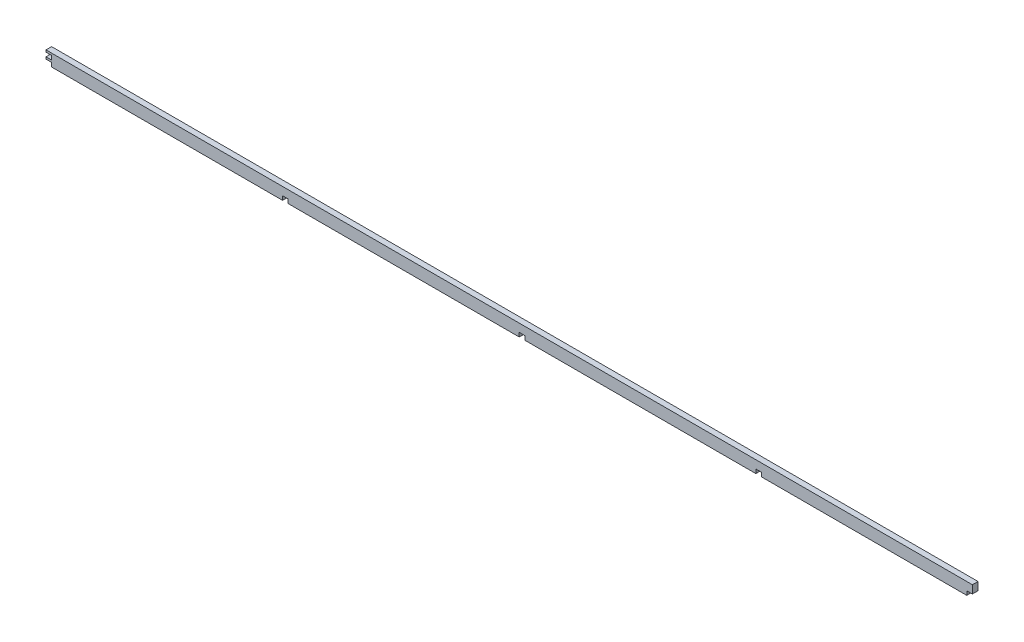
ISO-10303-21;
HEADER;
FILE_DESCRIPTION(('STEP AP214'),'2;1');
FILE_NAME('part.step','',(''),(''),'','','');
FILE_SCHEMA(('AUTOMOTIVE_DESIGN { 1 0 10303 214 1 1 1 1 }'));
ENDSEC;
DATA;
#1=APPLICATION_CONTEXT('core data for automotive mechanical design processes');
#2=APPLICATION_PROTOCOL_DEFINITION('international standard','automotive_design',2000,#1);
#3=PRODUCT_CONTEXT('',#1,'mechanical');
#4=PRODUCT('Part','Part','',(#3));
#5=PRODUCT_RELATED_PRODUCT_CATEGORY('part','',(#4));
#6=PRODUCT_DEFINITION_FORMATION('','',#4);
#7=PRODUCT_DEFINITION_CONTEXT('part definition',#1,'design');
#8=PRODUCT_DEFINITION('design','',#6,#7);
#9=PRODUCT_DEFINITION_SHAPE('','',#8);
#10=(LENGTH_UNIT() NAMED_UNIT(*) SI_UNIT(.MILLI.,.METRE.));
#11=(NAMED_UNIT(*) PLANE_ANGLE_UNIT() SI_UNIT($,.RADIAN.));
#12=(NAMED_UNIT(*) SI_UNIT($,.STERADIAN.) SOLID_ANGLE_UNIT());
#13=UNCERTAINTY_MEASURE_WITH_UNIT(LENGTH_MEASURE(1.E-05),#10,'distance_accuracy_value','');
#14=(GEOMETRIC_REPRESENTATION_CONTEXT(3) GLOBAL_UNCERTAINTY_ASSIGNED_CONTEXT((#13)) GLOBAL_UNIT_ASSIGNED_CONTEXT((#10,
#11,#12)) REPRESENTATION_CONTEXT('',''));
#15=CARTESIAN_POINT('',(0.,0.,0.));
#16=DIRECTION('',(0.,0.,1.));
#17=DIRECTION('',(1.,0.,0.));
#18=AXIS2_PLACEMENT_3D('',#15,#16,#17);
#19=CARTESIAN_POINT('',(229.199999999999,-0.999999999999996,1.4));
#20=DIRECTION('',(-1.,0.,0.));
#21=DIRECTION('',(0.,0.,1.));
#22=AXIS2_PLACEMENT_3D('',#19,#20,#21);
#23=PLANE('',#22);
#24=DIRECTION('',(0.,1.,0.));
#25=VECTOR('',#24,1.);
#26=CARTESIAN_POINT('',(229.199999999999,-0.999999999999996,-1.4));
#27=LINE('',#26,#25);
#28=CARTESIAN_POINT('',(229.199999999999,-0.999999999999996,-1.4));
#29=VERTEX_POINT('',#28);
#30=CARTESIAN_POINT('',(229.199999999999,3.,-1.4));
#31=VERTEX_POINT('',#30);
#32=EDGE_CURVE('E225',#29,#31,#27,.T.);
#33=ORIENTED_EDGE('',*,*,#32,.T.);
#34=DIRECTION('',(0.,0.,-1.));
#35=VECTOR('',#34,1.);
#36=CARTESIAN_POINT('',(229.199999999999,3.,1.4));
#37=LINE('',#36,#35);
#38=CARTESIAN_POINT('',(229.199999999999,3.,1.4));
#39=VERTEX_POINT('',#38);
#40=EDGE_CURVE('E11',#39,#31,#37,.T.);
#41=ORIENTED_EDGE('',*,*,#40,.F.);
#42=DIRECTION('',(0.,1.,0.));
#43=VECTOR('',#42,1.);
#44=CARTESIAN_POINT('',(229.199999999999,-0.999999999999996,1.4));
#45=LINE('',#44,#43);
#46=CARTESIAN_POINT('',(229.199999999999,-0.999999999999996,1.4));
#47=VERTEX_POINT('',#46);
#48=EDGE_CURVE('E271',#47,#39,#45,.T.);
#49=ORIENTED_EDGE('',*,*,#48,.F.);
#50=DIRECTION('',(0.,0.,-1.));
#51=VECTOR('',#50,1.);
#52=CARTESIAN_POINT('',(229.199999999999,-0.999999999999996,1.4));
#53=LINE('',#52,#51);
#54=EDGE_CURVE('E221',#47,#29,#53,.T.);
#55=ORIENTED_EDGE('',*,*,#54,.T.);
#56=EDGE_LOOP('',(#33,#41,#49,#55));
#57=FACE_BOUND('',#56,.T.);
#58=ADVANCED_FACE('F33',(#57),#23,.F.);
#59=CARTESIAN_POINT('',(-232.,3.,1.4));
#60=DIRECTION('',(0.,-1.,0.));
#61=DIRECTION('',(1.,0.,0.));
#62=AXIS2_PLACEMENT_3D('',#59,#60,#61);
#63=PLANE('',#62);
#64=DIRECTION('',(-1.,0.,0.));
#65=VECTOR('',#64,1.);
#66=CARTESIAN_POINT('',(-232.,3.,-1.4));
#67=LINE('',#66,#65);
#68=CARTESIAN_POINT('',(-232.,3.,-1.4));
#69=VERTEX_POINT('',#68);
#70=EDGE_CURVE('E228',#31,#69,#67,.T.);
#71=ORIENTED_EDGE('',*,*,#70,.T.);
#72=DIRECTION('',(0.,0.,-1.));
#73=VECTOR('',#72,1.);
#74=CARTESIAN_POINT('',(-232.,3.,1.4));
#75=LINE('',#74,#73);
#76=CARTESIAN_POINT('',(-232.,3.,1.4));
#77=VERTEX_POINT('',#76);
#78=EDGE_CURVE('E41',#77,#69,#75,.T.);
#79=ORIENTED_EDGE('',*,*,#78,.F.);
#80=DIRECTION('',(-1.,0.,0.));
#81=VECTOR('',#80,1.);
#82=CARTESIAN_POINT('',(-229.200000000001,3.,1.4));
#83=LINE('',#82,#81);
#84=EDGE_CURVE('E140',#39,#77,#83,.T.);
#85=ORIENTED_EDGE('',*,*,#84,.F.);
#86=ORIENTED_EDGE('',*,*,#40,.T.);
#87=EDGE_LOOP('',(#71,#79,#85,#86));
#88=FACE_BOUND('',#87,.T.);
#89=ADVANCED_FACE('F409',(#88),#63,.F.);
#90=CARTESIAN_POINT('',(-232.,2.,1.4));
#91=DIRECTION('',(1.,0.,0.));
#92=DIRECTION('',(0.,0.,-1.));
#93=AXIS2_PLACEMENT_3D('',#90,#91,#92);
#94=PLANE('',#93);
#95=DIRECTION('',(0.,-1.,0.));
#96=VECTOR('',#95,1.);
#97=CARTESIAN_POINT('',(-232.,2.,-1.4));
#98=LINE('',#97,#96);
#99=CARTESIAN_POINT('',(-232.,2.,-1.4));
#100=VERTEX_POINT('',#99);
#101=EDGE_CURVE('E230',#69,#100,#98,.T.);
#102=ORIENTED_EDGE('',*,*,#101,.T.);
#103=DIRECTION('',(0.,0.,-1.));
#104=VECTOR('',#103,1.);
#105=CARTESIAN_POINT('',(-232.,2.,1.4));
#106=LINE('',#105,#104);
#107=CARTESIAN_POINT('',(-232.,2.,1.4));
#108=VERTEX_POINT('',#107);
#109=EDGE_CURVE('E326',#108,#100,#106,.T.);
#110=ORIENTED_EDGE('',*,*,#109,.F.);
#111=DIRECTION('',(0.,-1.,0.));
#112=VECTOR('',#111,1.);
#113=CARTESIAN_POINT('',(-232.,2.,1.4));
#114=LINE('',#113,#112);
#115=EDGE_CURVE('E334',#77,#108,#114,.T.);
#116=ORIENTED_EDGE('',*,*,#115,.F.);
#117=ORIENTED_EDGE('',*,*,#78,.T.);
#118=EDGE_LOOP('',(#102,#110,#116,#117));
#119=FACE_BOUND('',#118,.T.);
#120=ADVANCED_FACE('F332',(#119),#94,.F.);
#121=CARTESIAN_POINT('',(-229.200000000001,2.,1.4));
#122=DIRECTION('',(0.,1.,0.));
#123=DIRECTION('',(-1.,0.,0.));
#124=AXIS2_PLACEMENT_3D('',#121,#122,#123);
#125=PLANE('',#124);
#126=DIRECTION('',(1.,0.,0.));
#127=VECTOR('',#126,1.);
#128=CARTESIAN_POINT('',(-229.200000000001,2.,-1.4));
#129=LINE('',#128,#127);
#130=CARTESIAN_POINT('',(-229.200000000001,2.,-1.4));
#131=VERTEX_POINT('',#130);
#132=EDGE_CURVE('E232',#100,#131,#129,.T.);
#133=ORIENTED_EDGE('',*,*,#132,.T.);
#134=DIRECTION('',(0.,0.,-1.));
#135=VECTOR('',#134,1.);
#136=CARTESIAN_POINT('',(-229.200000000001,2.,1.4));
#137=LINE('',#136,#135);
#138=CARTESIAN_POINT('',(-229.200000000001,2.,1.4));
#139=VERTEX_POINT('',#138);
#140=EDGE_CURVE('E323',#139,#131,#137,.T.);
#141=ORIENTED_EDGE('',*,*,#140,.F.);
#142=DIRECTION('',(1.,0.,0.));
#143=VECTOR('',#142,1.);
#144=CARTESIAN_POINT('',(-229.200000000001,2.,1.4));
#145=LINE('',#144,#143);
#146=EDGE_CURVE('E352',#108,#139,#145,.T.);
#147=ORIENTED_EDGE('',*,*,#146,.F.);
#148=ORIENTED_EDGE('',*,*,#109,.T.);
#149=EDGE_LOOP('',(#133,#141,#147,#148));
#150=FACE_BOUND('',#149,.T.);
#151=ADVANCED_FACE('F343',(#150),#125,.F.);
#152=CARTESIAN_POINT('',(-229.200000000001,0.,1.4));
#153=DIRECTION('',(1.,0.,0.));
#154=DIRECTION('',(0.,0.,-1.));
#155=AXIS2_PLACEMENT_3D('',#152,#153,#154);
#156=PLANE('',#155);
#157=DIRECTION('',(0.,-1.,0.));
#158=VECTOR('',#157,1.);
#159=CARTESIAN_POINT('',(-229.200000000001,0.,-1.4));
#160=LINE('',#159,#158);
#161=CARTESIAN_POINT('',(-229.200000000001,0.,-1.4));
#162=VERTEX_POINT('',#161);
#163=EDGE_CURVE('E234',#131,#162,#160,.T.);
#164=ORIENTED_EDGE('',*,*,#163,.T.);
#165=DIRECTION('',(0.,0.,-1.));
#166=VECTOR('',#165,1.);
#167=CARTESIAN_POINT('',(-229.200000000001,0.,1.4));
#168=LINE('',#167,#166);
#169=CARTESIAN_POINT('',(-229.200000000001,0.,1.4));
#170=VERTEX_POINT('',#169);
#171=EDGE_CURVE('E320',#170,#162,#168,.T.);
#172=ORIENTED_EDGE('',*,*,#171,.F.);
#173=DIRECTION('',(0.,-1.,0.));
#174=VECTOR('',#173,1.);
#175=CARTESIAN_POINT('',(-229.200000000001,0.,1.4));
#176=LINE('',#175,#174);
#177=EDGE_CURVE('E349',#139,#170,#176,.T.);
#178=ORIENTED_EDGE('',*,*,#177,.F.);
#179=ORIENTED_EDGE('',*,*,#140,.T.);
#180=EDGE_LOOP('',(#164,#172,#178,#179));
#181=FACE_BOUND('',#180,.T.);
#182=ADVANCED_FACE('F347',(#181),#156,.F.);
#183=CARTESIAN_POINT('',(-229.200000000001,0.,1.4));
#184=DIRECTION('',(0.,-1.,0.));
#185=DIRECTION('',(1.,0.,0.));
#186=AXIS2_PLACEMENT_3D('',#183,#184,#185);
#187=PLANE('',#186);
#188=DIRECTION('',(-1.,0.,0.));
#189=VECTOR('',#188,1.);
#190=CARTESIAN_POINT('',(-229.200000000001,0.,-1.4));
#191=LINE('',#190,#189);
#192=CARTESIAN_POINT('',(-232.,0.,-1.4));
#193=VERTEX_POINT('',#192);
#194=EDGE_CURVE('E236',#162,#193,#191,.T.);
#195=ORIENTED_EDGE('',*,*,#194,.T.);
#196=DIRECTION('',(0.,0.,-1.));
#197=VECTOR('',#196,1.);
#198=CARTESIAN_POINT('',(-232.,0.,1.4));
#199=LINE('',#198,#197);
#200=CARTESIAN_POINT('',(-232.,0.,1.4));
#201=VERTEX_POINT('',#200);
#202=EDGE_CURVE('E317',#201,#193,#199,.T.);
#203=ORIENTED_EDGE('',*,*,#202,.F.);
#204=DIRECTION('',(-1.,0.,0.));
#205=VECTOR('',#204,1.);
#206=CARTESIAN_POINT('',(-229.200000000001,0.,1.4));
#207=LINE('',#206,#205);
#208=EDGE_CURVE('E351',#170,#201,#207,.T.);
#209=ORIENTED_EDGE('',*,*,#208,.F.);
#210=ORIENTED_EDGE('',*,*,#171,.T.);
#211=EDGE_LOOP('',(#195,#203,#209,#210));
#212=FACE_BOUND('',#211,.T.);
#213=ADVANCED_FACE('F422',(#212),#187,.F.);
#214=CARTESIAN_POINT('',(-232.,0.,1.4));
#215=DIRECTION('',(1.,0.,0.));
#216=DIRECTION('',(0.,0.,-1.));
#217=AXIS2_PLACEMENT_3D('',#214,#215,#216);
#218=PLANE('',#217);
#219=DIRECTION('',(0.,-1.,0.));
#220=VECTOR('',#219,1.);
#221=CARTESIAN_POINT('',(-232.,0.,-1.4));
#222=LINE('',#221,#220);
#223=CARTESIAN_POINT('',(-232.,-0.999999999999996,-1.4));
#224=VERTEX_POINT('',#223);
#225=EDGE_CURVE('E238',#193,#224,#222,.T.);
#226=ORIENTED_EDGE('',*,*,#225,.T.);
#227=DIRECTION('',(0.,0.,-1.));
#228=VECTOR('',#227,1.);
#229=CARTESIAN_POINT('',(-232.,-0.999999999999996,1.4));
#230=LINE('',#229,#228);
#231=CARTESIAN_POINT('',(-232.,-0.999999999999996,1.4));
#232=VERTEX_POINT('',#231);
#233=EDGE_CURVE('E314',#232,#224,#230,.T.);
#234=ORIENTED_EDGE('',*,*,#233,.F.);
#235=DIRECTION('',(0.,-1.,0.));
#236=VECTOR('',#235,1.);
#237=CARTESIAN_POINT('',(-232.,0.,1.4));
#238=LINE('',#237,#236);
#239=EDGE_CURVE('E354',#201,#232,#238,.T.);
#240=ORIENTED_EDGE('',*,*,#239,.F.);
#241=ORIENTED_EDGE('',*,*,#202,.T.);
#242=EDGE_LOOP('',(#226,#234,#240,#241));
#243=FACE_BOUND('',#242,.T.);
#244=ADVANCED_FACE('F425',(#243),#218,.F.);
#245=CARTESIAN_POINT('',(-232.,-0.999999999999996,1.4));
#246=DIRECTION('',(0.,1.,0.));
#247=DIRECTION('',(-1.,0.,0.));
#248=AXIS2_PLACEMENT_3D('',#245,#246,#247);
#249=PLANE('',#248);
#250=DIRECTION('',(1.,0.,0.));
#251=VECTOR('',#250,1.);
#252=CARTESIAN_POINT('',(-232.,-0.999999999999996,-1.4));
#253=LINE('',#252,#251);
#254=CARTESIAN_POINT('',(-229.200000000001,-0.999999999999994,-1.4));
#255=VERTEX_POINT('',#254);
#256=EDGE_CURVE('E240',#224,#255,#253,.T.);
#257=ORIENTED_EDGE('',*,*,#256,.T.);
#258=DIRECTION('',(0.,0.,-1.));
#259=VECTOR('',#258,1.);
#260=CARTESIAN_POINT('',(-229.200000000001,-0.999999999999994,1.4));
#261=LINE('',#260,#259);
#262=CARTESIAN_POINT('',(-229.200000000001,-0.999999999999994,1.4));
#263=VERTEX_POINT('',#262);
#264=EDGE_CURVE('E311',#263,#255,#261,.T.);
#265=ORIENTED_EDGE('',*,*,#264,.F.);
#266=DIRECTION('',(1.,0.,0.));
#267=VECTOR('',#266,1.);
#268=CARTESIAN_POINT('',(-232.,-0.999999999999996,1.4));
#269=LINE('',#268,#267);
#270=EDGE_CURVE('E360',#232,#263,#269,.T.);
#271=ORIENTED_EDGE('',*,*,#270,.F.);
#272=ORIENTED_EDGE('',*,*,#233,.T.);
#273=EDGE_LOOP('',(#257,#265,#271,#272));
#274=FACE_BOUND('',#273,.T.);
#275=ADVANCED_FACE('F429',(#274),#249,.F.);
#276=CARTESIAN_POINT('',(-229.200000000001,-3.,1.4));
#277=DIRECTION('',(1.,0.,0.));
#278=DIRECTION('',(0.,0.,-1.));
#279=AXIS2_PLACEMENT_3D('',#276,#277,#278);
#280=PLANE('',#279);
#281=DIRECTION('',(0.,-1.,0.));
#282=VECTOR('',#281,1.);
#283=CARTESIAN_POINT('',(-229.200000000001,-3.,-1.4));
#284=LINE('',#283,#282);
#285=CARTESIAN_POINT('',(-229.200000000001,-3.,-1.4));
#286=VERTEX_POINT('',#285);
#287=EDGE_CURVE('E242',#255,#286,#284,.T.);
#288=ORIENTED_EDGE('',*,*,#287,.T.);
#289=DIRECTION('',(0.,0.,-1.));
#290=VECTOR('',#289,1.);
#291=CARTESIAN_POINT('',(-229.200000000001,-3.,1.4));
#292=LINE('',#291,#290);
#293=CARTESIAN_POINT('',(-229.200000000001,-3.,1.4));
#294=VERTEX_POINT('',#293);
#295=EDGE_CURVE('E308',#294,#286,#292,.T.);
#296=ORIENTED_EDGE('',*,*,#295,.F.);
#297=DIRECTION('',(0.,-1.,0.));
#298=VECTOR('',#297,1.);
#299=CARTESIAN_POINT('',(-229.200000000001,-3.,1.4));
#300=LINE('',#299,#298);
#301=EDGE_CURVE('E362',#263,#294,#300,.T.);
#302=ORIENTED_EDGE('',*,*,#301,.F.);
#303=ORIENTED_EDGE('',*,*,#264,.T.);
#304=EDGE_LOOP('',(#288,#296,#302,#303));
#305=FACE_BOUND('',#304,.T.);
#306=ADVANCED_FACE('F433',(#305),#280,.F.);
#307=CARTESIAN_POINT('',(-229.200000000001,-3.,1.4));
#308=DIRECTION('',(0.,1.,0.));
#309=DIRECTION('',(0.,0.,1.));
#310=AXIS2_PLACEMENT_3D('',#307,#308,#309);
#311=PLANE('',#310);
#312=DIRECTION('',(1.,0.,0.));
#313=VECTOR('',#312,1.);
#314=CARTESIAN_POINT('',(-229.200000000001,-3.,-1.4));
#315=LINE('',#314,#313);
#316=CARTESIAN_POINT('',(-114.2,-3.,-1.4));
#317=VERTEX_POINT('',#316);
#318=EDGE_CURVE('E244',#286,#317,#315,.T.);
#319=ORIENTED_EDGE('',*,*,#318,.T.);
#320=DIRECTION('',(0.,0.,-1.));
#321=VECTOR('',#320,1.);
#322=CARTESIAN_POINT('',(-114.2,-3.,1.4));
#323=LINE('',#322,#321);
#324=CARTESIAN_POINT('',(-114.2,-3.,1.4));
#325=VERTEX_POINT('',#324);
#326=EDGE_CURVE('E305',#325,#317,#323,.T.);
#327=ORIENTED_EDGE('',*,*,#326,.F.);
#328=DIRECTION('',(1.,0.,0.));
#329=VECTOR('',#328,1.);
#330=CARTESIAN_POINT('',(-229.200000000001,-3.,1.4));
#331=LINE('',#330,#329);
#332=EDGE_CURVE('E364',#294,#325,#331,.T.);
#333=ORIENTED_EDGE('',*,*,#332,.F.);
#334=ORIENTED_EDGE('',*,*,#295,.T.);
#335=EDGE_LOOP('',(#319,#327,#333,#334));
#336=FACE_BOUND('',#335,.T.);
#337=ADVANCED_FACE('F437',(#336),#311,.F.);
#338=CARTESIAN_POINT('',(-114.2,-3.,1.4));
#339=DIRECTION('',(-1.,0.,0.));
#340=DIRECTION('',(0.,0.,1.));
#341=AXIS2_PLACEMENT_3D('',#338,#339,#340);
#342=PLANE('',#341);
#343=DIRECTION('',(0.,1.,0.));
#344=VECTOR('',#343,1.);
#345=CARTESIAN_POINT('',(-114.2,-3.,-1.4));
#346=LINE('',#345,#344);
#347=CARTESIAN_POINT('',(-114.2,-0.999999999999996,-1.4));
#348=VERTEX_POINT('',#347);
#349=EDGE_CURVE('E246',#317,#348,#346,.T.);
#350=ORIENTED_EDGE('',*,*,#349,.T.);
#351=DIRECTION('',(0.,0.,-1.));
#352=VECTOR('',#351,1.);
#353=CARTESIAN_POINT('',(-114.2,-0.999999999999996,1.4));
#354=LINE('',#353,#352);
#355=CARTESIAN_POINT('',(-114.2,-0.999999999999996,1.4));
#356=VERTEX_POINT('',#355);
#357=EDGE_CURVE('E302',#356,#348,#354,.T.);
#358=ORIENTED_EDGE('',*,*,#357,.F.);
#359=DIRECTION('',(0.,1.,0.));
#360=VECTOR('',#359,1.);
#361=CARTESIAN_POINT('',(-114.2,-3.,1.4));
#362=LINE('',#361,#360);
#363=EDGE_CURVE('E366',#325,#356,#362,.T.);
#364=ORIENTED_EDGE('',*,*,#363,.F.);
#365=ORIENTED_EDGE('',*,*,#326,.T.);
#366=EDGE_LOOP('',(#350,#358,#364,#365));
#367=FACE_BOUND('',#366,.T.);
#368=ADVANCED_FACE('F441',(#367),#342,.F.);
#369=CARTESIAN_POINT('',(-114.2,-0.999999999999996,1.4));
#370=DIRECTION('',(0.,1.,0.));
#371=DIRECTION('',(0.,0.,1.));
#372=AXIS2_PLACEMENT_3D('',#369,#370,#371);
#373=PLANE('',#372);
#374=DIRECTION('',(1.,0.,0.));
#375=VECTOR('',#374,1.);
#376=CARTESIAN_POINT('',(-114.2,-0.999999999999996,-1.4));
#377=LINE('',#376,#375);
#378=CARTESIAN_POINT('',(-111.4,-0.999999999999996,-1.4));
#379=VERTEX_POINT('',#378);
#380=EDGE_CURVE('E248',#348,#379,#377,.T.);
#381=ORIENTED_EDGE('',*,*,#380,.T.);
#382=DIRECTION('',(0.,0.,-1.));
#383=VECTOR('',#382,1.);
#384=CARTESIAN_POINT('',(-111.4,-0.999999999999996,1.4));
#385=LINE('',#384,#383);
#386=CARTESIAN_POINT('',(-111.4,-0.999999999999996,1.4));
#387=VERTEX_POINT('',#386);
#388=EDGE_CURVE('E299',#387,#379,#385,.T.);
#389=ORIENTED_EDGE('',*,*,#388,.F.);
#390=DIRECTION('',(1.,0.,0.));
#391=VECTOR('',#390,1.);
#392=CARTESIAN_POINT('',(-114.2,-0.999999999999996,1.4));
#393=LINE('',#392,#391);
#394=EDGE_CURVE('E368',#356,#387,#393,.T.);
#395=ORIENTED_EDGE('',*,*,#394,.F.);
#396=ORIENTED_EDGE('',*,*,#357,.T.);
#397=EDGE_LOOP('',(#381,#389,#395,#396));
#398=FACE_BOUND('',#397,.T.);
#399=ADVANCED_FACE('F445',(#398),#373,.F.);
#400=CARTESIAN_POINT('',(-111.4,-0.999999999999996,1.4));
#401=DIRECTION('',(1.,0.,0.));
#402=DIRECTION('',(0.,0.,-1.));
#403=AXIS2_PLACEMENT_3D('',#400,#401,#402);
#404=PLANE('',#403);
#405=DIRECTION('',(0.,-1.,0.));
#406=VECTOR('',#405,1.);
#407=CARTESIAN_POINT('',(-111.4,-0.999999999999996,-1.4));
#408=LINE('',#407,#406);
#409=CARTESIAN_POINT('',(-111.4,-3.,-1.4));
#410=VERTEX_POINT('',#409);
#411=EDGE_CURVE('E250',#379,#410,#408,.T.);
#412=ORIENTED_EDGE('',*,*,#411,.T.);
#413=DIRECTION('',(0.,0.,-1.));
#414=VECTOR('',#413,1.);
#415=CARTESIAN_POINT('',(-111.4,-3.,1.4));
#416=LINE('',#415,#414);
#417=CARTESIAN_POINT('',(-111.4,-3.,1.4));
#418=VERTEX_POINT('',#417);
#419=EDGE_CURVE('E296',#418,#410,#416,.T.);
#420=ORIENTED_EDGE('',*,*,#419,.F.);
#421=DIRECTION('',(0.,-1.,0.));
#422=VECTOR('',#421,1.);
#423=CARTESIAN_POINT('',(-111.4,-0.999999999999996,1.4));
#424=LINE('',#423,#422);
#425=EDGE_CURVE('E370',#387,#418,#424,.T.);
#426=ORIENTED_EDGE('',*,*,#425,.F.);
#427=ORIENTED_EDGE('',*,*,#388,.T.);
#428=EDGE_LOOP('',(#412,#420,#426,#427));
#429=FACE_BOUND('',#428,.T.);
#430=ADVANCED_FACE('F449',(#429),#404,.F.);
#431=CARTESIAN_POINT('',(-111.4,-3.,1.4));
#432=DIRECTION('',(0.,1.,0.));
#433=DIRECTION('',(0.,0.,1.));
#434=AXIS2_PLACEMENT_3D('',#431,#432,#433);
#435=PLANE('',#434);
#436=DIRECTION('',(1.,0.,0.));
#437=VECTOR('',#436,1.);
#438=CARTESIAN_POINT('',(-111.4,-3.,-1.4));
#439=LINE('',#438,#437);
#440=CARTESIAN_POINT('',(3.59999999999952,-3.,-1.4));
#441=VERTEX_POINT('',#440);
#442=EDGE_CURVE('E252',#410,#441,#439,.T.);
#443=ORIENTED_EDGE('',*,*,#442,.T.);
#444=DIRECTION('',(0.,0.,-1.));
#445=VECTOR('',#444,1.);
#446=CARTESIAN_POINT('',(3.59999999999952,-3.,1.4));
#447=LINE('',#446,#445);
#448=CARTESIAN_POINT('',(3.59999999999952,-3.,1.4));
#449=VERTEX_POINT('',#448);
#450=EDGE_CURVE('E293',#449,#441,#447,.T.);
#451=ORIENTED_EDGE('',*,*,#450,.F.);
#452=DIRECTION('',(1.,0.,0.));
#453=VECTOR('',#452,1.);
#454=CARTESIAN_POINT('',(-111.4,-3.,1.4));
#455=LINE('',#454,#453);
#456=EDGE_CURVE('E372',#418,#449,#455,.T.);
#457=ORIENTED_EDGE('',*,*,#456,.F.);
#458=ORIENTED_EDGE('',*,*,#419,.T.);
#459=EDGE_LOOP('',(#443,#451,#457,#458));
#460=FACE_BOUND('',#459,.T.);
#461=ADVANCED_FACE('F453',(#460),#435,.F.);
#462=CARTESIAN_POINT('',(3.59999999999952,-3.,1.4));
#463=DIRECTION('',(-1.,0.,0.));
#464=DIRECTION('',(0.,-1.,0.));
#465=AXIS2_PLACEMENT_3D('',#462,#463,#464);
#466=PLANE('',#465);
#467=DIRECTION('',(0.,1.,0.));
#468=VECTOR('',#467,1.);
#469=CARTESIAN_POINT('',(3.59999999999952,-3.,-1.4));
#470=LINE('',#469,#468);
#471=CARTESIAN_POINT('',(3.59999999999953,-0.999999999999996,-1.4));
#472=VERTEX_POINT('',#471);
#473=EDGE_CURVE('E254',#441,#472,#470,.T.);
#474=ORIENTED_EDGE('',*,*,#473,.T.);
#475=DIRECTION('',(0.,0.,-1.));
#476=VECTOR('',#475,1.);
#477=CARTESIAN_POINT('',(3.59999999999953,-0.999999999999996,1.4));
#478=LINE('',#477,#476);
#479=CARTESIAN_POINT('',(3.59999999999953,-0.999999999999996,1.4));
#480=VERTEX_POINT('',#479);
#481=EDGE_CURVE('E290',#480,#472,#478,.T.);
#482=ORIENTED_EDGE('',*,*,#481,.F.);
#483=DIRECTION('',(0.,1.,0.));
#484=VECTOR('',#483,1.);
#485=CARTESIAN_POINT('',(3.59999999999952,-3.,1.4));
#486=LINE('',#485,#484);
#487=EDGE_CURVE('E374',#449,#480,#486,.T.);
#488=ORIENTED_EDGE('',*,*,#487,.F.);
#489=ORIENTED_EDGE('',*,*,#450,.T.);
#490=EDGE_LOOP('',(#474,#482,#488,#489));
#491=FACE_BOUND('',#490,.T.);
#492=ADVANCED_FACE('F457',(#491),#466,.F.);
#493=CARTESIAN_POINT('',(3.59999999999953,-0.999999999999996,1.4));
#494=DIRECTION('',(0.,1.,0.));
#495=DIRECTION('',(0.,0.,1.));
#496=AXIS2_PLACEMENT_3D('',#493,#494,#495);
#497=PLANE('',#496);
#498=DIRECTION('',(1.,0.,0.));
#499=VECTOR('',#498,1.);
#500=CARTESIAN_POINT('',(3.59999999999953,-0.999999999999996,-1.4));
#501=LINE('',#500,#499);
#502=CARTESIAN_POINT('',(6.39999999999952,-0.999999999999996,-1.4));
#503=VERTEX_POINT('',#502);
#504=EDGE_CURVE('E256',#472,#503,#501,.T.);
#505=ORIENTED_EDGE('',*,*,#504,.T.);
#506=DIRECTION('',(0.,0.,-1.));
#507=VECTOR('',#506,1.);
#508=CARTESIAN_POINT('',(6.39999999999952,-0.999999999999996,1.4));
#509=LINE('',#508,#507);
#510=CARTESIAN_POINT('',(6.39999999999952,-0.999999999999996,1.4));
#511=VERTEX_POINT('',#510);
#512=EDGE_CURVE('E287',#511,#503,#509,.T.);
#513=ORIENTED_EDGE('',*,*,#512,.F.);
#514=DIRECTION('',(1.,0.,0.));
#515=VECTOR('',#514,1.);
#516=CARTESIAN_POINT('',(3.59999999999953,-0.999999999999996,1.4));
#517=LINE('',#516,#515);
#518=EDGE_CURVE('E376',#480,#511,#517,.T.);
#519=ORIENTED_EDGE('',*,*,#518,.F.);
#520=ORIENTED_EDGE('',*,*,#481,.T.);
#521=EDGE_LOOP('',(#505,#513,#519,#520));
#522=FACE_BOUND('',#521,.T.);
#523=ADVANCED_FACE('F461',(#522),#497,.F.);
#524=CARTESIAN_POINT('',(6.39999999999952,-0.999999999999996,1.4));
#525=DIRECTION('',(1.,0.,0.));
#526=DIRECTION('',(0.,0.,-1.));
#527=AXIS2_PLACEMENT_3D('',#524,#525,#526);
#528=PLANE('',#527);
#529=DIRECTION('',(0.,-1.,0.));
#530=VECTOR('',#529,1.);
#531=CARTESIAN_POINT('',(6.39999999999952,-0.999999999999996,-1.4));
#532=LINE('',#531,#530);
#533=CARTESIAN_POINT('',(6.39999999999952,-3.,-1.4));
#534=VERTEX_POINT('',#533);
#535=EDGE_CURVE('E258',#503,#534,#532,.T.);
#536=ORIENTED_EDGE('',*,*,#535,.T.);
#537=DIRECTION('',(0.,0.,-1.));
#538=VECTOR('',#537,1.);
#539=CARTESIAN_POINT('',(6.39999999999952,-3.,1.4));
#540=LINE('',#539,#538);
#541=CARTESIAN_POINT('',(6.39999999999952,-3.,1.4));
#542=VERTEX_POINT('',#541);
#543=EDGE_CURVE('E284',#542,#534,#540,.T.);
#544=ORIENTED_EDGE('',*,*,#543,.F.);
#545=DIRECTION('',(0.,-1.,0.));
#546=VECTOR('',#545,1.);
#547=CARTESIAN_POINT('',(6.39999999999952,-0.999999999999996,1.4));
#548=LINE('',#547,#546);
#549=EDGE_CURVE('E378',#511,#542,#548,.T.);
#550=ORIENTED_EDGE('',*,*,#549,.F.);
#551=ORIENTED_EDGE('',*,*,#512,.T.);
#552=EDGE_LOOP('',(#536,#544,#550,#551));
#553=FACE_BOUND('',#552,.T.);
#554=ADVANCED_FACE('F465',(#553),#528,.F.);
#555=CARTESIAN_POINT('',(6.39999999999952,-3.,1.4));
#556=DIRECTION('',(0.,1.,0.));
#557=DIRECTION('',(0.,0.,1.));
#558=AXIS2_PLACEMENT_3D('',#555,#556,#557);
#559=PLANE('',#558);
#560=DIRECTION('',(1.,0.,0.));
#561=VECTOR('',#560,1.);
#562=CARTESIAN_POINT('',(6.39999999999952,-3.,-1.4));
#563=LINE('',#562,#561);
#564=CARTESIAN_POINT('',(121.4,-3.,-1.4));
#565=VERTEX_POINT('',#564);
#566=EDGE_CURVE('E260',#534,#565,#563,.T.);
#567=ORIENTED_EDGE('',*,*,#566,.T.);
#568=DIRECTION('',(0.,0.,-1.));
#569=VECTOR('',#568,1.);
#570=CARTESIAN_POINT('',(121.4,-3.,1.4));
#571=LINE('',#570,#569);
#572=CARTESIAN_POINT('',(121.4,-3.,1.4));
#573=VERTEX_POINT('',#572);
#574=EDGE_CURVE('E281',#573,#565,#571,.T.);
#575=ORIENTED_EDGE('',*,*,#574,.F.);
#576=DIRECTION('',(1.,0.,0.));
#577=VECTOR('',#576,1.);
#578=CARTESIAN_POINT('',(6.39999999999952,-3.,1.4));
#579=LINE('',#578,#577);
#580=EDGE_CURVE('E380',#542,#573,#579,.T.);
#581=ORIENTED_EDGE('',*,*,#580,.F.);
#582=ORIENTED_EDGE('',*,*,#543,.T.);
#583=EDGE_LOOP('',(#567,#575,#581,#582));
#584=FACE_BOUND('',#583,.T.);
#585=ADVANCED_FACE('F469',(#584),#559,.F.);
#586=CARTESIAN_POINT('',(121.4,-3.,1.4));
#587=DIRECTION('',(-1.,0.,0.));
#588=DIRECTION('',(0.,0.,1.));
#589=AXIS2_PLACEMENT_3D('',#586,#587,#588);
#590=PLANE('',#589);
#591=DIRECTION('',(0.,1.,0.));
#592=VECTOR('',#591,1.);
#593=CARTESIAN_POINT('',(121.4,-3.,-1.4));
#594=LINE('',#593,#592);
#595=CARTESIAN_POINT('',(121.4,-0.999999999999997,-1.4));
#596=VERTEX_POINT('',#595);
#597=EDGE_CURVE('E262',#565,#596,#594,.T.);
#598=ORIENTED_EDGE('',*,*,#597,.T.);
#599=DIRECTION('',(0.,0.,-1.));
#600=VECTOR('',#599,1.);
#601=CARTESIAN_POINT('',(121.4,-0.999999999999997,1.4));
#602=LINE('',#601,#600);
#603=CARTESIAN_POINT('',(121.4,-0.999999999999997,1.4));
#604=VERTEX_POINT('',#603);
#605=EDGE_CURVE('E278',#604,#596,#602,.T.);
#606=ORIENTED_EDGE('',*,*,#605,.F.);
#607=DIRECTION('',(0.,1.,0.));
#608=VECTOR('',#607,1.);
#609=CARTESIAN_POINT('',(121.4,-3.,1.4));
#610=LINE('',#609,#608);
#611=EDGE_CURVE('E382',#573,#604,#610,.T.);
#612=ORIENTED_EDGE('',*,*,#611,.F.);
#613=ORIENTED_EDGE('',*,*,#574,.T.);
#614=EDGE_LOOP('',(#598,#606,#612,#613));
#615=FACE_BOUND('',#614,.T.);
#616=ADVANCED_FACE('F473',(#615),#590,.F.);
#617=CARTESIAN_POINT('',(121.4,-0.999999999999997,1.4));
#618=DIRECTION('',(0.,1.,0.));
#619=DIRECTION('',(-1.,0.,0.));
#620=AXIS2_PLACEMENT_3D('',#617,#618,#619);
#621=PLANE('',#620);
#622=DIRECTION('',(1.,0.,0.));
#623=VECTOR('',#622,1.);
#624=CARTESIAN_POINT('',(121.4,-0.999999999999997,-1.4));
#625=LINE('',#624,#623);
#626=CARTESIAN_POINT('',(124.2,-0.999999999999997,-1.4));
#627=VERTEX_POINT('',#626);
#628=EDGE_CURVE('E264',#596,#627,#625,.T.);
#629=ORIENTED_EDGE('',*,*,#628,.T.);
#630=DIRECTION('',(0.,0.,-1.));
#631=VECTOR('',#630,1.);
#632=CARTESIAN_POINT('',(124.2,-0.999999999999997,1.4));
#633=LINE('',#632,#631);
#634=CARTESIAN_POINT('',(124.2,-0.999999999999997,1.4));
#635=VERTEX_POINT('',#634);
#636=EDGE_CURVE('E275',#635,#627,#633,.T.);
#637=ORIENTED_EDGE('',*,*,#636,.F.);
#638=DIRECTION('',(1.,0.,0.));
#639=VECTOR('',#638,1.);
#640=CARTESIAN_POINT('',(121.4,-0.999999999999997,1.4));
#641=LINE('',#640,#639);
#642=EDGE_CURVE('E384',#604,#635,#641,.T.);
#643=ORIENTED_EDGE('',*,*,#642,.F.);
#644=ORIENTED_EDGE('',*,*,#605,.T.);
#645=EDGE_LOOP('',(#629,#637,#643,#644));
#646=FACE_BOUND('',#645,.T.);
#647=ADVANCED_FACE('F390',(#646),#621,.F.);
#648=CARTESIAN_POINT('',(124.2,-0.999999999999997,1.4));
#649=DIRECTION('',(1.,0.,0.));
#650=DIRECTION('',(0.,0.,-1.));
#651=AXIS2_PLACEMENT_3D('',#648,#649,#650);
#652=PLANE('',#651);
#653=DIRECTION('',(0.,-1.,0.));
#654=VECTOR('',#653,1.);
#655=CARTESIAN_POINT('',(124.2,-0.999999999999997,-1.4));
#656=LINE('',#655,#654);
#657=CARTESIAN_POINT('',(124.2,-3.,-1.4));
#658=VERTEX_POINT('',#657);
#659=EDGE_CURVE('E266',#627,#658,#656,.T.);
#660=ORIENTED_EDGE('',*,*,#659,.T.);
#661=DIRECTION('',(0.,0.,-1.));
#662=VECTOR('',#661,1.);
#663=CARTESIAN_POINT('',(124.2,-3.,1.4));
#664=LINE('',#663,#662);
#665=CARTESIAN_POINT('',(124.2,-3.,1.4));
#666=VERTEX_POINT('',#665);
#667=EDGE_CURVE('E216',#666,#658,#664,.T.);
#668=ORIENTED_EDGE('',*,*,#667,.F.);
#669=DIRECTION('',(0.,-1.,0.));
#670=VECTOR('',#669,1.);
#671=CARTESIAN_POINT('',(124.2,-0.999999999999997,1.4));
#672=LINE('',#671,#670);
#673=EDGE_CURVE('E207',#635,#666,#672,.T.);
#674=ORIENTED_EDGE('',*,*,#673,.F.);
#675=ORIENTED_EDGE('',*,*,#636,.T.);
#676=EDGE_LOOP('',(#660,#668,#674,#675));
#677=FACE_BOUND('',#676,.T.);
#678=ADVANCED_FACE('F394',(#677),#652,.F.);
#679=CARTESIAN_POINT('',(124.2,-3.,1.4));
#680=DIRECTION('',(0.,1.,0.));
#681=DIRECTION('',(0.,0.,1.));
#682=AXIS2_PLACEMENT_3D('',#679,#680,#681);
#683=PLANE('',#682);
#684=DIRECTION('',(1.,0.,0.));
#685=VECTOR('',#684,1.);
#686=CARTESIAN_POINT('',(124.2,-3.,-1.4));
#687=LINE('',#686,#685);
#688=CARTESIAN_POINT('',(226.399999999999,-3.,-1.4));
#689=VERTEX_POINT('',#688);
#690=EDGE_CURVE('E215',#658,#689,#687,.T.);
#691=ORIENTED_EDGE('',*,*,#690,.T.);
#692=DIRECTION('',(0.,0.,-1.));
#693=VECTOR('',#692,1.);
#694=CARTESIAN_POINT('',(226.399999999999,-3.,1.4));
#695=LINE('',#694,#693);
#696=CARTESIAN_POINT('',(226.399999999999,-3.,1.4));
#697=VERTEX_POINT('',#696);
#698=EDGE_CURVE('E212',#697,#689,#695,.T.);
#699=ORIENTED_EDGE('',*,*,#698,.F.);
#700=DIRECTION('',(1.,0.,0.));
#701=VECTOR('',#700,1.);
#702=CARTESIAN_POINT('',(124.2,-3.,1.4));
#703=LINE('',#702,#701);
#704=EDGE_CURVE('E201',#666,#697,#703,.T.);
#705=ORIENTED_EDGE('',*,*,#704,.F.);
#706=ORIENTED_EDGE('',*,*,#667,.T.);
#707=EDGE_LOOP('',(#691,#699,#705,#706));
#708=FACE_BOUND('',#707,.T.);
#709=ADVANCED_FACE('F213',(#708),#683,.F.);
#710=CARTESIAN_POINT('',(226.399999999999,-3.,1.4));
#711=DIRECTION('',(-1.,0.,0.));
#712=DIRECTION('',(0.,0.,1.));
#713=AXIS2_PLACEMENT_3D('',#710,#711,#712);
#714=PLANE('',#713);
#715=DIRECTION('',(0.,1.,0.));
#716=VECTOR('',#715,1.);
#717=CARTESIAN_POINT('',(226.399999999999,-3.,-1.4));
#718=LINE('',#717,#716);
#719=CARTESIAN_POINT('',(226.399999999999,-0.999999999999996,-1.4));
#720=VERTEX_POINT('',#719);
#721=EDGE_CURVE('E126',#689,#720,#718,.T.);
#722=ORIENTED_EDGE('',*,*,#721,.T.);
#723=DIRECTION('',(0.,0.,-1.));
#724=VECTOR('',#723,1.);
#725=CARTESIAN_POINT('',(226.399999999999,-0.999999999999996,1.4));
#726=LINE('',#725,#724);
#727=CARTESIAN_POINT('',(226.399999999999,-0.999999999999996,1.4));
#728=VERTEX_POINT('',#727);
#729=EDGE_CURVE('E217',#728,#720,#726,.T.);
#730=ORIENTED_EDGE('',*,*,#729,.F.);
#731=DIRECTION('',(0.,1.,0.));
#732=VECTOR('',#731,1.);
#733=CARTESIAN_POINT('',(226.399999999999,-3.,1.4));
#734=LINE('',#733,#732);
#735=EDGE_CURVE('E205',#697,#728,#734,.T.);
#736=ORIENTED_EDGE('',*,*,#735,.F.);
#737=ORIENTED_EDGE('',*,*,#698,.T.);
#738=EDGE_LOOP('',(#722,#730,#736,#737));
#739=FACE_BOUND('',#738,.T.);
#740=ADVANCED_FACE('F219',(#739),#714,.F.);
#741=CARTESIAN_POINT('',(226.399999999999,-0.999999999999996,1.4));
#742=DIRECTION('',(0.,1.,0.));
#743=DIRECTION('',(0.,0.,1.));
#744=AXIS2_PLACEMENT_3D('',#741,#742,#743);
#745=PLANE('',#744);
#746=DIRECTION('',(1.,0.,0.));
#747=VECTOR('',#746,1.);
#748=CARTESIAN_POINT('',(226.399999999999,-0.999999999999996,-1.4));
#749=LINE('',#748,#747);
#750=EDGE_CURVE('E132',#720,#29,#749,.T.);
#751=ORIENTED_EDGE('',*,*,#750,.T.);
#752=ORIENTED_EDGE('',*,*,#54,.F.);
#753=DIRECTION('',(1.,0.,0.));
#754=VECTOR('',#753,1.);
#755=CARTESIAN_POINT('',(226.399999999999,-0.999999999999996,1.4));
#756=LINE('',#755,#754);
#757=EDGE_CURVE('E49',#728,#47,#756,.T.);
#758=ORIENTED_EDGE('',*,*,#757,.F.);
#759=ORIENTED_EDGE('',*,*,#729,.T.);
#760=EDGE_LOOP('',(#751,#752,#758,#759));
#761=FACE_BOUND('',#760,.T.);
#762=ADVANCED_FACE('F398',(#761),#745,.F.);
#763=CARTESIAN_POINT('',(0.,0.,1.4));
#764=DIRECTION('',(0.,0.,-1.));
#765=DIRECTION('',(-1.,0.,0.));
#766=AXIS2_PLACEMENT_3D('',#763,#764,#765);
#767=PLANE('',#766);
#768=ORIENTED_EDGE('',*,*,#48,.T.);
#769=ORIENTED_EDGE('',*,*,#84,.T.);
#770=ORIENTED_EDGE('',*,*,#115,.T.);
#771=ORIENTED_EDGE('',*,*,#146,.T.);
#772=ORIENTED_EDGE('',*,*,#177,.T.);
#773=ORIENTED_EDGE('',*,*,#208,.T.);
#774=ORIENTED_EDGE('',*,*,#239,.T.);
#775=ORIENTED_EDGE('',*,*,#270,.T.);
#776=ORIENTED_EDGE('',*,*,#301,.T.);
#777=ORIENTED_EDGE('',*,*,#332,.T.);
#778=ORIENTED_EDGE('',*,*,#363,.T.);
#779=ORIENTED_EDGE('',*,*,#394,.T.);
#780=ORIENTED_EDGE('',*,*,#425,.T.);
#781=ORIENTED_EDGE('',*,*,#456,.T.);
#782=ORIENTED_EDGE('',*,*,#487,.T.);
#783=ORIENTED_EDGE('',*,*,#518,.T.);
#784=ORIENTED_EDGE('',*,*,#549,.T.);
#785=ORIENTED_EDGE('',*,*,#580,.T.);
#786=ORIENTED_EDGE('',*,*,#611,.T.);
#787=ORIENTED_EDGE('',*,*,#642,.T.);
#788=ORIENTED_EDGE('',*,*,#673,.T.);
#789=ORIENTED_EDGE('',*,*,#704,.T.);
#790=ORIENTED_EDGE('',*,*,#735,.T.);
#791=ORIENTED_EDGE('',*,*,#757,.T.);
#792=EDGE_LOOP('',(#768,#769,#770,#771,#772,#773,#774,#775,#776,#777,#778,#779,#780,#781,#782,
#783,#784,#785,#786,#787,#788,#789,#790,#791));
#793=FACE_BOUND('',#792,.T.);
#794=ADVANCED_FACE('F203',(#793),#767,.F.);
#795=CARTESIAN_POINT('',(0.,0.,-1.4));
#796=DIRECTION('',(0.,0.,-1.));
#797=DIRECTION('',(-1.,0.,0.));
#798=AXIS2_PLACEMENT_3D('',#795,#796,#797);
#799=PLANE('',#798);
#800=ORIENTED_EDGE('',*,*,#32,.F.);
#801=ORIENTED_EDGE('',*,*,#750,.F.);
#802=ORIENTED_EDGE('',*,*,#721,.F.);
#803=ORIENTED_EDGE('',*,*,#690,.F.);
#804=ORIENTED_EDGE('',*,*,#659,.F.);
#805=ORIENTED_EDGE('',*,*,#628,.F.);
#806=ORIENTED_EDGE('',*,*,#597,.F.);
#807=ORIENTED_EDGE('',*,*,#566,.F.);
#808=ORIENTED_EDGE('',*,*,#535,.F.);
#809=ORIENTED_EDGE('',*,*,#504,.F.);
#810=ORIENTED_EDGE('',*,*,#473,.F.);
#811=ORIENTED_EDGE('',*,*,#442,.F.);
#812=ORIENTED_EDGE('',*,*,#411,.F.);
#813=ORIENTED_EDGE('',*,*,#380,.F.);
#814=ORIENTED_EDGE('',*,*,#349,.F.);
#815=ORIENTED_EDGE('',*,*,#318,.F.);
#816=ORIENTED_EDGE('',*,*,#287,.F.);
#817=ORIENTED_EDGE('',*,*,#256,.F.);
#818=ORIENTED_EDGE('',*,*,#225,.F.);
#819=ORIENTED_EDGE('',*,*,#194,.F.);
#820=ORIENTED_EDGE('',*,*,#163,.F.);
#821=ORIENTED_EDGE('',*,*,#132,.F.);
#822=ORIENTED_EDGE('',*,*,#101,.F.);
#823=ORIENTED_EDGE('',*,*,#70,.F.);
#824=EDGE_LOOP('',(#800,#801,#802,#803,#804,#805,#806,#807,#808,#809,#810,#811,#812,#813,#814,
#815,#816,#817,#818,#819,#820,#821,#822,#823));
#825=FACE_BOUND('',#824,.T.);
#826=ADVANCED_FACE('F338',(#825),#799,.T.);
#827=CLOSED_SHELL('',(#58,#89,#120,#151,#182,#213,#244,#275,#306,#337,#368,#399,#430,#461,#492,
#523,#554,#585,#616,#647,#678,#709,#740,#762,#794,#826));
#828=MANIFOLD_SOLID_BREP('B2',#827);
#829=ADVANCED_BREP_SHAPE_REPRESENTATION('',(#18,#828),#14);
#830=SHAPE_DEFINITION_REPRESENTATION(#9,#829);
ENDSEC;
END-ISO-10303-21;
